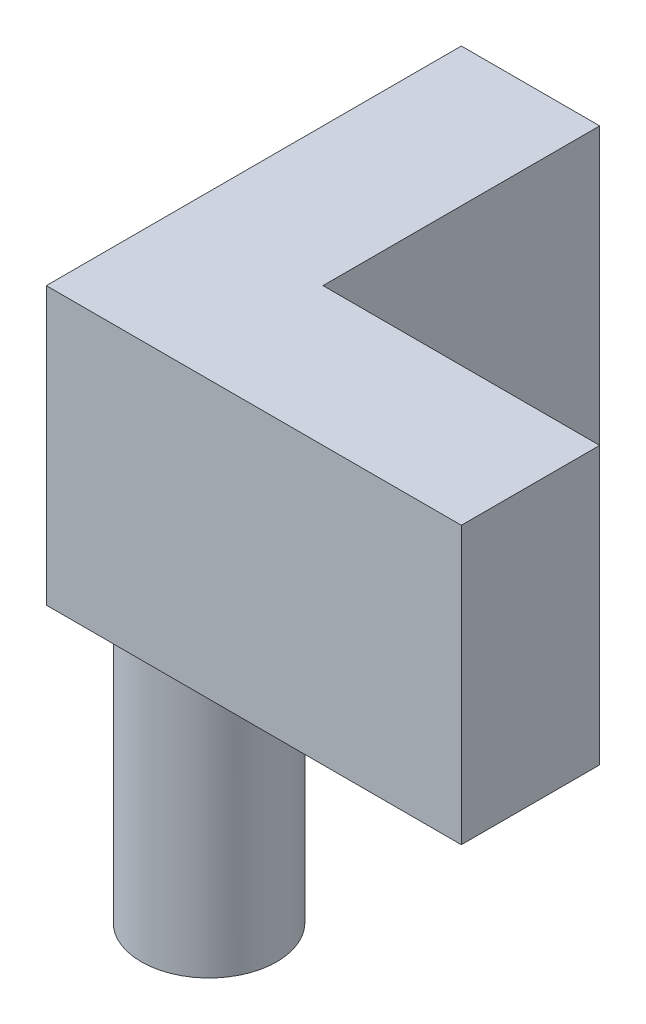
ISO-10303-21;
HEADER;
FILE_DESCRIPTION(('STEP AP214'),'2;1');
FILE_NAME('part.step','',(''),(''),'','','');
FILE_SCHEMA(('AUTOMOTIVE_DESIGN { 1 0 10303 214 1 1 1 1 }'));
ENDSEC;
DATA;
#1=APPLICATION_CONTEXT('core data for automotive mechanical design processes');
#2=APPLICATION_PROTOCOL_DEFINITION('international standard','automotive_design',2000,#1);
#3=PRODUCT_CONTEXT('',#1,'mechanical');
#4=PRODUCT('Part','Part','',(#3));
#5=PRODUCT_RELATED_PRODUCT_CATEGORY('part','',(#4));
#6=PRODUCT_DEFINITION_FORMATION('','',#4);
#7=PRODUCT_DEFINITION_CONTEXT('part definition',#1,'design');
#8=PRODUCT_DEFINITION('design','',#6,#7);
#9=PRODUCT_DEFINITION_SHAPE('','',#8);
#10=(LENGTH_UNIT() NAMED_UNIT(*) SI_UNIT(.MILLI.,.METRE.));
#11=(NAMED_UNIT(*) PLANE_ANGLE_UNIT() SI_UNIT($,.RADIAN.));
#12=(NAMED_UNIT(*) SI_UNIT($,.STERADIAN.) SOLID_ANGLE_UNIT());
#13=UNCERTAINTY_MEASURE_WITH_UNIT(LENGTH_MEASURE(1.E-05),#10,'distance_accuracy_value','');
#14=(GEOMETRIC_REPRESENTATION_CONTEXT(3) GLOBAL_UNCERTAINTY_ASSIGNED_CONTEXT((#13)) GLOBAL_UNIT_ASSIGNED_CONTEXT((#10,
#11,#12)) REPRESENTATION_CONTEXT('',''));
#15=CARTESIAN_POINT('',(0.,0.,0.));
#16=DIRECTION('',(0.,0.,1.));
#17=DIRECTION('',(1.,0.,0.));
#18=AXIS2_PLACEMENT_3D('',#15,#16,#17);
#19=CARTESIAN_POINT('',(0.,10.,0.));
#20=DIRECTION('',(0.,-1.,0.));
#21=DIRECTION('',(0.,0.,-1.));
#22=AXIS2_PLACEMENT_3D('',#19,#20,#21);
#23=PLANE('',#22);
#24=DIRECTION('',(0.,0.,-1.));
#25=VECTOR('',#24,1.);
#26=CARTESIAN_POINT('',(5.,10.,-5.));
#27=LINE('',#26,#25);
#28=CARTESIAN_POINT('',(5.,10.,-5.));
#29=VERTEX_POINT('',#28);
#30=CARTESIAN_POINT('',(5.,10.,-15.));
#31=VERTEX_POINT('',#30);
#32=EDGE_CURVE('E129',#29,#31,#27,.T.);
#33=ORIENTED_EDGE('',*,*,#32,.T.);
#34=DIRECTION('',(-1.,0.,0.));
#35=VECTOR('',#34,1.);
#36=CARTESIAN_POINT('',(0.,10.,-15.));
#37=LINE('',#36,#35);
#38=CARTESIAN_POINT('',(0.,10.,-15.));
#39=VERTEX_POINT('',#38);
#40=EDGE_CURVE('E88',#31,#39,#37,.T.);
#41=ORIENTED_EDGE('',*,*,#40,.T.);
#42=DIRECTION('',(0.,0.,1.));
#43=VECTOR('',#42,1.);
#44=CARTESIAN_POINT('',(0.,10.,-15.));
#45=LINE('',#44,#43);
#46=CARTESIAN_POINT('',(0.,10.,0.));
#47=VERTEX_POINT('',#46);
#48=EDGE_CURVE('E100',#39,#47,#45,.T.);
#49=ORIENTED_EDGE('',*,*,#48,.T.);
#50=DIRECTION('',(1.,0.,0.));
#51=VECTOR('',#50,1.);
#52=CARTESIAN_POINT('',(0.,10.,0.));
#53=LINE('',#52,#51);
#54=CARTESIAN_POINT('',(15.,10.,0.));
#55=VERTEX_POINT('',#54);
#56=EDGE_CURVE('E95',#47,#55,#53,.T.);
#57=ORIENTED_EDGE('',*,*,#56,.T.);
#58=DIRECTION('',(0.,0.,-1.));
#59=VECTOR('',#58,1.);
#60=CARTESIAN_POINT('',(15.,10.,0.));
#61=LINE('',#60,#59);
#62=CARTESIAN_POINT('',(15.,10.,-5.));
#63=VERTEX_POINT('',#62);
#64=EDGE_CURVE('E98',#55,#63,#61,.T.);
#65=ORIENTED_EDGE('',*,*,#64,.T.);
#66=DIRECTION('',(-1.,0.,0.));
#67=VECTOR('',#66,1.);
#68=CARTESIAN_POINT('',(5.,10.,-5.));
#69=LINE('',#68,#67);
#70=EDGE_CURVE('E50',#63,#29,#69,.T.);
#71=ORIENTED_EDGE('',*,*,#70,.T.);
#72=EDGE_LOOP('',(#33,#41,#49,#57,#65,#71));
#73=FACE_BOUND('',#72,.T.);
#74=ADVANCED_FACE('F33',(#73),#23,.F.);
#75=CARTESIAN_POINT('',(0.,0.,0.));
#76=DIRECTION('',(0.,-1.,0.));
#77=DIRECTION('',(0.,0.,-1.));
#78=AXIS2_PLACEMENT_3D('',#75,#76,#77);
#79=PLANE('',#78);
#80=CARTESIAN_POINT('',(2.87994854663509,0.,-3.00079319131008));
#81=DIRECTION('',(0.,-1.,0.));
#82=DIRECTION('',(0.,0.,-1.));
#83=AXIS2_PLACEMENT_3D('',#80,#81,#82);
#84=CIRCLE('',#83,2.45);
#85=CARTESIAN_POINT('',(2.87994854663509,0.,-5.45079319131008));
#86=VERTEX_POINT('',#85);
#87=EDGE_CURVE('E11',#86,#86,#84,.T.);
#88=ORIENTED_EDGE('',*,*,#87,.F.);
#89=EDGE_LOOP('',(#88));
#90=FACE_BOUND('',#89,.T.);
#91=DIRECTION('',(0.,0.,-1.));
#92=VECTOR('',#91,1.);
#93=CARTESIAN_POINT('',(5.,0.,-5.));
#94=LINE('',#93,#92);
#95=CARTESIAN_POINT('',(5.,0.,-5.));
#96=VERTEX_POINT('',#95);
#97=CARTESIAN_POINT('',(5.,0.,-15.));
#98=VERTEX_POINT('',#97);
#99=EDGE_CURVE('E118',#96,#98,#94,.T.);
#100=ORIENTED_EDGE('',*,*,#99,.F.);
#101=DIRECTION('',(-1.,0.,0.));
#102=VECTOR('',#101,1.);
#103=CARTESIAN_POINT('',(5.,0.,-5.));
#104=LINE('',#103,#102);
#105=CARTESIAN_POINT('',(15.,0.,-5.));
#106=VERTEX_POINT('',#105);
#107=EDGE_CURVE('E79',#106,#96,#104,.T.);
#108=ORIENTED_EDGE('',*,*,#107,.F.);
#109=DIRECTION('',(0.,0.,-1.));
#110=VECTOR('',#109,1.);
#111=CARTESIAN_POINT('',(15.,0.,0.));
#112=LINE('',#111,#110);
#113=CARTESIAN_POINT('',(15.,0.,0.));
#114=VERTEX_POINT('',#113);
#115=EDGE_CURVE('E73',#114,#106,#112,.T.);
#116=ORIENTED_EDGE('',*,*,#115,.F.);
#117=DIRECTION('',(1.,0.,0.));
#118=VECTOR('',#117,1.);
#119=CARTESIAN_POINT('',(0.,0.,0.));
#120=LINE('',#119,#118);
#121=CARTESIAN_POINT('',(0.,0.,0.));
#122=VERTEX_POINT('',#121);
#123=EDGE_CURVE('E108',#122,#114,#120,.T.);
#124=ORIENTED_EDGE('',*,*,#123,.F.);
#125=DIRECTION('',(0.,0.,1.));
#126=VECTOR('',#125,1.);
#127=CARTESIAN_POINT('',(0.,0.,-15.));
#128=LINE('',#127,#126);
#129=CARTESIAN_POINT('',(0.,0.,-15.));
#130=VERTEX_POINT('',#129);
#131=EDGE_CURVE('E124',#130,#122,#128,.T.);
#132=ORIENTED_EDGE('',*,*,#131,.F.);
#133=DIRECTION('',(-1.,0.,0.));
#134=VECTOR('',#133,1.);
#135=CARTESIAN_POINT('',(0.,0.,-15.));
#136=LINE('',#135,#134);
#137=EDGE_CURVE('E121',#98,#130,#136,.T.);
#138=ORIENTED_EDGE('',*,*,#137,.F.);
#139=EDGE_LOOP('',(#100,#108,#116,#124,#132,#138));
#140=FACE_BOUND('',#139,.T.);
#141=ADVANCED_FACE('F141',(#90,#140),#79,.T.);
#142=CARTESIAN_POINT('',(5.,10.,-5.));
#143=DIRECTION('',(-1.,0.,0.));
#144=DIRECTION('',(0.,0.,1.));
#145=AXIS2_PLACEMENT_3D('',#142,#143,#144);
#146=PLANE('',#145);
#147=ORIENTED_EDGE('',*,*,#99,.T.);
#148=DIRECTION('',(0.,-1.,0.));
#149=VECTOR('',#148,1.);
#150=CARTESIAN_POINT('',(5.,10.,-15.));
#151=LINE('',#150,#149);
#152=EDGE_CURVE('E42',#31,#98,#151,.T.);
#153=ORIENTED_EDGE('',*,*,#152,.F.);
#154=ORIENTED_EDGE('',*,*,#32,.F.);
#155=DIRECTION('',(0.,-1.,0.));
#156=VECTOR('',#155,1.);
#157=CARTESIAN_POINT('',(5.,10.,-5.));
#158=LINE('',#157,#156);
#159=EDGE_CURVE('E114',#29,#96,#158,.T.);
#160=ORIENTED_EDGE('',*,*,#159,.T.);
#161=EDGE_LOOP('',(#147,#153,#154,#160));
#162=FACE_BOUND('',#161,.T.);
#163=ADVANCED_FACE('F35',(#162),#146,.F.);
#164=CARTESIAN_POINT('',(0.,10.,-15.));
#165=DIRECTION('',(0.,0.,1.));
#166=DIRECTION('',(1.,0.,0.));
#167=AXIS2_PLACEMENT_3D('',#164,#165,#166);
#168=PLANE('',#167);
#169=ORIENTED_EDGE('',*,*,#137,.T.);
#170=DIRECTION('',(0.,-1.,0.));
#171=VECTOR('',#170,1.);
#172=CARTESIAN_POINT('',(0.,10.,-15.));
#173=LINE('',#172,#171);
#174=EDGE_CURVE('E133',#39,#130,#173,.T.);
#175=ORIENTED_EDGE('',*,*,#174,.F.);
#176=ORIENTED_EDGE('',*,*,#40,.F.);
#177=ORIENTED_EDGE('',*,*,#152,.T.);
#178=EDGE_LOOP('',(#169,#175,#176,#177));
#179=FACE_BOUND('',#178,.T.);
#180=ADVANCED_FACE('F136',(#179),#168,.F.);
#181=CARTESIAN_POINT('',(0.,10.,-15.));
#182=DIRECTION('',(1.,0.,0.));
#183=DIRECTION('',(0.,0.,-1.));
#184=AXIS2_PLACEMENT_3D('',#181,#182,#183);
#185=PLANE('',#184);
#186=ORIENTED_EDGE('',*,*,#131,.T.);
#187=DIRECTION('',(0.,-1.,0.));
#188=VECTOR('',#187,1.);
#189=CARTESIAN_POINT('',(0.,10.,0.));
#190=LINE('',#189,#188);
#191=EDGE_CURVE('E109',#47,#122,#190,.T.);
#192=ORIENTED_EDGE('',*,*,#191,.F.);
#193=ORIENTED_EDGE('',*,*,#48,.F.);
#194=ORIENTED_EDGE('',*,*,#174,.T.);
#195=EDGE_LOOP('',(#186,#192,#193,#194));
#196=FACE_BOUND('',#195,.T.);
#197=ADVANCED_FACE('F144',(#196),#185,.F.);
#198=CARTESIAN_POINT('',(0.,10.,0.));
#199=DIRECTION('',(0.,0.,-1.));
#200=DIRECTION('',(-1.,0.,0.));
#201=AXIS2_PLACEMENT_3D('',#198,#199,#200);
#202=PLANE('',#201);
#203=ORIENTED_EDGE('',*,*,#123,.T.);
#204=DIRECTION('',(0.,-1.,0.));
#205=VECTOR('',#204,1.);
#206=CARTESIAN_POINT('',(15.,10.,0.));
#207=LINE('',#206,#205);
#208=EDGE_CURVE('E105',#55,#114,#207,.T.);
#209=ORIENTED_EDGE('',*,*,#208,.F.);
#210=ORIENTED_EDGE('',*,*,#56,.F.);
#211=ORIENTED_EDGE('',*,*,#191,.T.);
#212=EDGE_LOOP('',(#203,#209,#210,#211));
#213=FACE_BOUND('',#212,.T.);
#214=ADVANCED_FACE('F106',(#213),#202,.F.);
#215=CARTESIAN_POINT('',(15.,10.,0.));
#216=DIRECTION('',(-1.,0.,0.));
#217=DIRECTION('',(0.,0.,1.));
#218=AXIS2_PLACEMENT_3D('',#215,#216,#217);
#219=PLANE('',#218);
#220=ORIENTED_EDGE('',*,*,#115,.T.);
#221=DIRECTION('',(0.,-1.,0.));
#222=VECTOR('',#221,1.);
#223=CARTESIAN_POINT('',(15.,10.,-5.));
#224=LINE('',#223,#222);
#225=EDGE_CURVE('E110',#63,#106,#224,.T.);
#226=ORIENTED_EDGE('',*,*,#225,.F.);
#227=ORIENTED_EDGE('',*,*,#64,.F.);
#228=ORIENTED_EDGE('',*,*,#208,.T.);
#229=EDGE_LOOP('',(#220,#226,#227,#228));
#230=FACE_BOUND('',#229,.T.);
#231=ADVANCED_FACE('F112',(#230),#219,.F.);
#232=CARTESIAN_POINT('',(5.,10.,-5.));
#233=DIRECTION('',(0.,0.,1.));
#234=DIRECTION('',(1.,0.,0.));
#235=AXIS2_PLACEMENT_3D('',#232,#233,#234);
#236=PLANE('',#235);
#237=ORIENTED_EDGE('',*,*,#107,.T.);
#238=ORIENTED_EDGE('',*,*,#159,.F.);
#239=ORIENTED_EDGE('',*,*,#70,.F.);
#240=ORIENTED_EDGE('',*,*,#225,.T.);
#241=EDGE_LOOP('',(#237,#238,#239,#240));
#242=FACE_BOUND('',#241,.T.);
#243=ADVANCED_FACE('F159',(#242),#236,.F.);
#244=CARTESIAN_POINT('',(2.87994854663509,-10.,-3.00079319131008));
#245=DIRECTION('',(0.,1.,0.));
#246=DIRECTION('',(0.,0.,1.));
#247=AXIS2_PLACEMENT_3D('',#244,#245,#246);
#248=CYLINDRICAL_SURFACE('',#247,2.45);
#249=ORIENTED_EDGE('',*,*,#87,.T.);
#250=EDGE_LOOP('',(#249));
#251=FACE_BOUND('',#250,.T.);
#252=CARTESIAN_POINT('',(2.87994854663509,-10.,-3.00079319131008));
#253=DIRECTION('',(0.,1.,0.));
#254=DIRECTION('',(0.,0.,1.));
#255=AXIS2_PLACEMENT_3D('',#252,#253,#254);
#256=CIRCLE('',#255,2.45);
#257=CARTESIAN_POINT('',(2.87994854663509,-10.,-0.550793191310079));
#258=VERTEX_POINT('',#257);
#259=EDGE_CURVE('E122',#258,#258,#256,.T.);
#260=ORIENTED_EDGE('',*,*,#259,.T.);
#261=EDGE_LOOP('',(#260));
#262=FACE_BOUND('',#261,.T.);
#263=ADVANCED_FACE('F151',(#251,#262),#248,.T.);
#264=CARTESIAN_POINT('',(2.87994854663509,-10.,-3.00079319131008));
#265=DIRECTION('',(0.,1.,0.));
#266=DIRECTION('',(0.,0.,1.));
#267=AXIS2_PLACEMENT_3D('',#264,#265,#266);
#268=PLANE('',#267);
#269=ORIENTED_EDGE('',*,*,#259,.F.);
#270=EDGE_LOOP('',(#269));
#271=FACE_BOUND('',#270,.T.);
#272=ADVANCED_FACE('F153',(#271),#268,.F.);
#273=CLOSED_SHELL('',(#74,#141,#163,#180,#197,#214,#231,#243,#263,#272));
#274=MANIFOLD_SOLID_BREP('B2',#273);
#275=ADVANCED_BREP_SHAPE_REPRESENTATION('',(#18,#274),#14);
#276=SHAPE_DEFINITION_REPRESENTATION(#9,#275);
ENDSEC;
END-ISO-10303-21;
